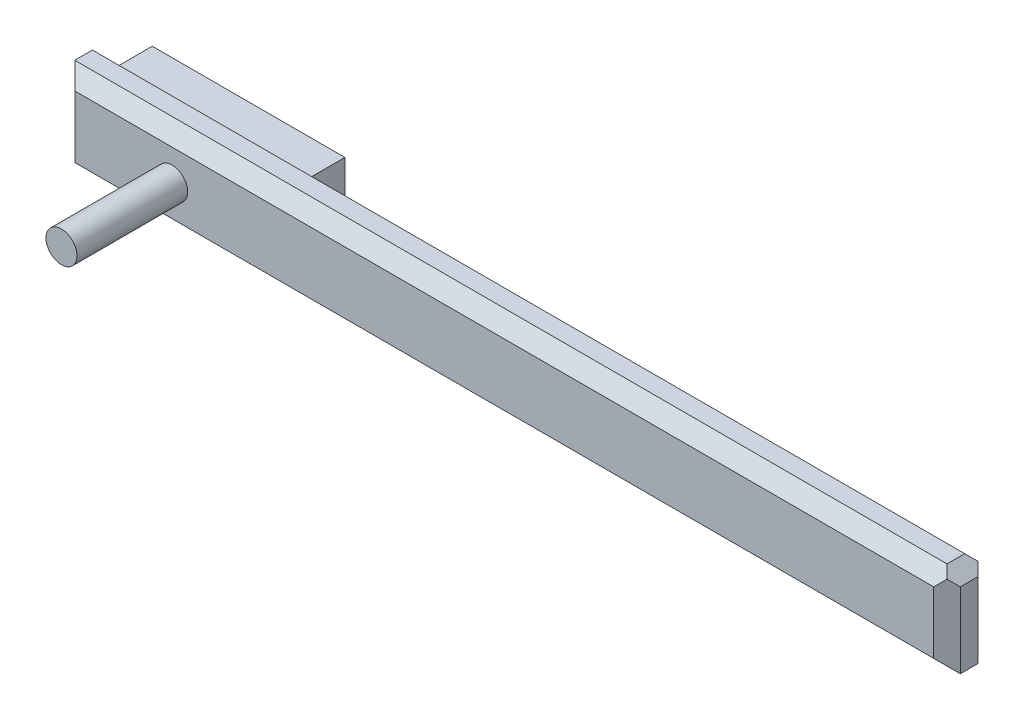
ISO-10303-21;
HEADER;
FILE_DESCRIPTION(('STEP AP214'),'2;1');
FILE_NAME('part.step','',(''),(''),'','','');
FILE_SCHEMA(('AUTOMOTIVE_DESIGN { 1 0 10303 214 1 1 1 1 }'));
ENDSEC;
DATA;
#1=APPLICATION_CONTEXT('core data for automotive mechanical design processes');
#2=APPLICATION_PROTOCOL_DEFINITION('international standard','automotive_design',2000,#1);
#3=PRODUCT_CONTEXT('',#1,'mechanical');
#4=PRODUCT('Part','Part','',(#3));
#5=PRODUCT_RELATED_PRODUCT_CATEGORY('part','',(#4));
#6=PRODUCT_DEFINITION_FORMATION('','',#4);
#7=PRODUCT_DEFINITION_CONTEXT('part definition',#1,'design');
#8=PRODUCT_DEFINITION('design','',#6,#7);
#9=PRODUCT_DEFINITION_SHAPE('','',#8);
#10=(LENGTH_UNIT() NAMED_UNIT(*) SI_UNIT(.MILLI.,.METRE.));
#11=(NAMED_UNIT(*) PLANE_ANGLE_UNIT() SI_UNIT($,.RADIAN.));
#12=(NAMED_UNIT(*) SI_UNIT($,.STERADIAN.) SOLID_ANGLE_UNIT());
#13=UNCERTAINTY_MEASURE_WITH_UNIT(LENGTH_MEASURE(1.E-05),#10,'distance_accuracy_value','');
#14=(GEOMETRIC_REPRESENTATION_CONTEXT(3) GLOBAL_UNCERTAINTY_ASSIGNED_CONTEXT((#13)) GLOBAL_UNIT_ASSIGNED_CONTEXT((#10,
#11,#12)) REPRESENTATION_CONTEXT('',''));
#15=CARTESIAN_POINT('',(0.,0.,0.));
#16=DIRECTION('',(0.,0.,1.));
#17=DIRECTION('',(1.,0.,0.));
#18=AXIS2_PLACEMENT_3D('',#15,#16,#17);
#19=CARTESIAN_POINT('',(0.,0.,0.));
#20=DIRECTION('',(0.,0.,1.));
#21=DIRECTION('',(1.,0.,0.));
#22=AXIS2_PLACEMENT_3D('',#19,#20,#21);
#23=PLANE('',#22);
#24=DIRECTION('',(0.,-1.,0.));
#25=VECTOR('',#24,1.);
#26=CARTESIAN_POINT('',(-5.34890927355179,0.7,0.));
#27=LINE('',#26,#25);
#28=CARTESIAN_POINT('',(-5.34890927355179,0.7,0.));
#29=VERTEX_POINT('',#28);
#30=CARTESIAN_POINT('',(-5.34890927355179,-0.7,0.));
#31=VERTEX_POINT('',#30);
#32=EDGE_CURVE('E58',#29,#31,#27,.T.);
#33=ORIENTED_EDGE('',*,*,#32,.F.);
#34=DIRECTION('',(1.,0.,0.));
#35=VECTOR('',#34,1.);
#36=CARTESIAN_POINT('',(0.,0.7,0.));
#37=LINE('',#36,#35);
#38=CARTESIAN_POINT('',(9.7,0.7,0.));
#39=VERTEX_POINT('',#38);
#40=EDGE_CURVE('E202',#29,#39,#37,.T.);
#41=ORIENTED_EDGE('',*,*,#40,.T.);
#42=DIRECTION('',(0.,-1.,0.));
#43=VECTOR('',#42,1.);
#44=CARTESIAN_POINT('',(9.7,0.,0.));
#45=LINE('',#44,#43);
#46=CARTESIAN_POINT('',(9.7,-0.7,0.));
#47=VERTEX_POINT('',#46);
#48=EDGE_CURVE('E205',#39,#47,#45,.T.);
#49=ORIENTED_EDGE('',*,*,#48,.T.);
#50=DIRECTION('',(-1.,0.,0.));
#51=VECTOR('',#50,1.);
#52=CARTESIAN_POINT('',(0.,-0.7,0.));
#53=LINE('',#52,#51);
#54=EDGE_CURVE('E242',#47,#31,#53,.T.);
#55=ORIENTED_EDGE('',*,*,#54,.T.);
#56=EDGE_LOOP('',(#33,#41,#49,#55));
#57=FACE_BOUND('',#56,.T.);
#58=ADVANCED_FACE('F41',(#57),#23,.F.);
#59=CARTESIAN_POINT('',(10.,1.,1.));
#60=DIRECTION('',(-1.,0.,0.));
#61=DIRECTION('',(0.,0.,1.));
#62=AXIS2_PLACEMENT_3D('',#59,#60,#61);
#63=PLANE('',#62);
#64=DIRECTION('',(0.,0.,-1.));
#65=VECTOR('',#64,1.);
#66=CARTESIAN_POINT('',(10.,-1.,1.));
#67=LINE('',#66,#65);
#68=CARTESIAN_POINT('',(10.,-1.,0.699999999999997));
#69=VERTEX_POINT('',#68);
#70=CARTESIAN_POINT('',(10.,-1.,0.3));
#71=VERTEX_POINT('',#70);
#72=EDGE_CURVE('E170',#69,#71,#67,.T.);
#73=ORIENTED_EDGE('',*,*,#72,.T.);
#74=DIRECTION('',(0.,1.,0.));
#75=VECTOR('',#74,1.);
#76=CARTESIAN_POINT('',(10.,1.,0.3));
#77=LINE('',#76,#75);
#78=CARTESIAN_POINT('',(10.,0.700000000000002,0.3));
#79=VERTEX_POINT('',#78);
#80=EDGE_CURVE('E191',#71,#79,#77,.T.);
#81=ORIENTED_EDGE('',*,*,#80,.T.);
#82=DIRECTION('',(0.,0.,1.));
#83=VECTOR('',#82,1.);
#84=CARTESIAN_POINT('',(10.,0.700000000000002,1.));
#85=LINE('',#84,#83);
#86=CARTESIAN_POINT('',(10.,0.700000000000002,0.699999999999997));
#87=VERTEX_POINT('',#86);
#88=EDGE_CURVE('E186',#79,#87,#85,.T.);
#89=ORIENTED_EDGE('',*,*,#88,.T.);
#90=DIRECTION('',(0.,-1.,0.));
#91=VECTOR('',#90,1.);
#92=CARTESIAN_POINT('',(10.,-1.,0.699999999999997));
#93=LINE('',#92,#91);
#94=EDGE_CURVE('E189',#87,#69,#93,.T.);
#95=ORIENTED_EDGE('',*,*,#94,.T.);
#96=EDGE_LOOP('',(#73,#81,#89,#95));
#97=FACE_BOUND('',#96,.T.);
#98=ADVANCED_FACE('F257',(#97),#63,.F.);
#99=CARTESIAN_POINT('',(-10.,1.,1.));
#100=DIRECTION('',(0.,-1.,0.));
#101=DIRECTION('',(0.,0.,-1.));
#102=AXIS2_PLACEMENT_3D('',#99,#100,#101);
#103=PLANE('',#102);
#104=DIRECTION('',(0.,0.,-1.));
#105=VECTOR('',#104,1.);
#106=CARTESIAN_POINT('',(9.7,1.,1.));
#107=LINE('',#106,#105);
#108=CARTESIAN_POINT('',(9.7,1.,0.699999999999997));
#109=VERTEX_POINT('',#108);
#110=CARTESIAN_POINT('',(9.7,1.,0.3));
#111=VERTEX_POINT('',#110);
#112=EDGE_CURVE('E183',#109,#111,#107,.T.);
#113=ORIENTED_EDGE('',*,*,#112,.T.);
#114=DIRECTION('',(-1.,0.,0.));
#115=VECTOR('',#114,1.);
#116=CARTESIAN_POINT('',(-10.,1.,0.3));
#117=LINE('',#116,#115);
#118=CARTESIAN_POINT('',(-10.,1.,0.3));
#119=VERTEX_POINT('',#118);
#120=EDGE_CURVE('E221',#111,#119,#117,.T.);
#121=ORIENTED_EDGE('',*,*,#120,.T.);
#122=DIRECTION('',(0.,0.,-1.));
#123=VECTOR('',#122,1.);
#124=CARTESIAN_POINT('',(-10.,1.,1.));
#125=LINE('',#124,#123);
#126=CARTESIAN_POINT('',(-10.,1.,0.699999999999997));
#127=VERTEX_POINT('',#126);
#128=EDGE_CURVE('E180',#127,#119,#125,.T.);
#129=ORIENTED_EDGE('',*,*,#128,.F.);
#130=DIRECTION('',(1.,0.,0.));
#131=VECTOR('',#130,1.);
#132=CARTESIAN_POINT('',(9.7,1.,0.699999999999997));
#133=LINE('',#132,#131);
#134=EDGE_CURVE('E219',#127,#109,#133,.T.);
#135=ORIENTED_EDGE('',*,*,#134,.T.);
#136=EDGE_LOOP('',(#113,#121,#129,#135));
#137=FACE_BOUND('',#136,.T.);
#138=ADVANCED_FACE('F276',(#137),#103,.F.);
#139=CARTESIAN_POINT('',(-10.,1.,1.));
#140=DIRECTION('',(1.,0.,0.));
#141=DIRECTION('',(0.,0.,-1.));
#142=AXIS2_PLACEMENT_3D('',#139,#140,#141);
#143=PLANE('',#142);
#144=DIRECTION('',(0.,0.,-1.));
#145=VECTOR('',#144,1.);
#146=CARTESIAN_POINT('',(-10.,-1.,1.));
#147=LINE('',#146,#145);
#148=CARTESIAN_POINT('',(-10.,-1.,0.699999999999997));
#149=VERTEX_POINT('',#148);
#150=CARTESIAN_POINT('',(-10.,-1.,0.3));
#151=VERTEX_POINT('',#150);
#152=EDGE_CURVE('E177',#149,#151,#147,.T.);
#153=ORIENTED_EDGE('',*,*,#152,.F.);
#154=DIRECTION('',(0.,1.,0.));
#155=VECTOR('',#154,1.);
#156=CARTESIAN_POINT('',(-10.,0.699999999999998,0.700000000000002));
#157=LINE('',#156,#155);
#158=EDGE_CURVE('E238',#149,#127,#157,.T.);
#159=ORIENTED_EDGE('',*,*,#158,.T.);
#160=ORIENTED_EDGE('',*,*,#128,.T.);
#161=DIRECTION('',(0.,-1.,0.));
#162=VECTOR('',#161,1.);
#163=CARTESIAN_POINT('',(-10.,1.,0.3));
#164=LINE('',#163,#162);
#165=EDGE_CURVE('E235',#119,#151,#164,.T.);
#166=ORIENTED_EDGE('',*,*,#165,.T.);
#167=EDGE_LOOP('',(#153,#159,#160,#166));
#168=FACE_BOUND('',#167,.T.);
#169=ADVANCED_FACE('F321',(#168),#143,.F.);
#170=CARTESIAN_POINT('',(-10.,-1.,1.));
#171=DIRECTION('',(0.,1.,0.));
#172=DIRECTION('',(0.,0.,1.));
#173=AXIS2_PLACEMENT_3D('',#170,#171,#172);
#174=PLANE('',#173);
#175=ORIENTED_EDGE('',*,*,#152,.T.);
#176=DIRECTION('',(1.,0.,0.));
#177=VECTOR('',#176,1.);
#178=CARTESIAN_POINT('',(-10.,-1.,0.3));
#179=LINE('',#178,#177);
#180=EDGE_CURVE('E51',#151,#71,#179,.T.);
#181=ORIENTED_EDGE('',*,*,#180,.T.);
#182=ORIENTED_EDGE('',*,*,#72,.F.);
#183=DIRECTION('',(-1.,0.,0.));
#184=VECTOR('',#183,1.);
#185=CARTESIAN_POINT('',(-10.,-1.,0.699999999999997));
#186=LINE('',#185,#184);
#187=EDGE_CURVE('E208',#69,#149,#186,.T.);
#188=ORIENTED_EDGE('',*,*,#187,.T.);
#189=EDGE_LOOP('',(#175,#181,#182,#188));
#190=FACE_BOUND('',#189,.T.);
#191=ADVANCED_FACE('F250',(#190),#174,.F.);
#192=CARTESIAN_POINT('',(0.,0.,1.));
#193=DIRECTION('',(0.,0.,1.));
#194=DIRECTION('',(1.,0.,0.));
#195=AXIS2_PLACEMENT_3D('',#192,#193,#194);
#196=PLANE('',#195);
#197=CARTESIAN_POINT('',(-7.5,0.,1.));
#198=DIRECTION('',(0.,0.,1.));
#199=DIRECTION('',(1.,0.,0.));
#200=AXIS2_PLACEMENT_3D('',#197,#198,#199);
#201=CIRCLE('',#200,0.35);
#202=CARTESIAN_POINT('',(-7.15,0.,1.));
#203=VERTEX_POINT('',#202);
#204=EDGE_CURVE('E171',#203,#203,#201,.T.);
#205=ORIENTED_EDGE('',*,*,#204,.F.);
#206=EDGE_LOOP('',(#205));
#207=FACE_BOUND('',#206,.T.);
#208=DIRECTION('',(-1.,0.,0.));
#209=VECTOR('',#208,1.);
#210=CARTESIAN_POINT('',(-10.,0.699999999999998,1.));
#211=LINE('',#210,#209);
#212=CARTESIAN_POINT('',(9.7,0.699999999999998,1.));
#213=VERTEX_POINT('',#212);
#214=CARTESIAN_POINT('',(-9.7,0.699999999999998,1.));
#215=VERTEX_POINT('',#214);
#216=EDGE_CURVE('E211',#213,#215,#211,.T.);
#217=ORIENTED_EDGE('',*,*,#216,.T.);
#218=DIRECTION('',(0.,-1.,0.));
#219=VECTOR('',#218,1.);
#220=CARTESIAN_POINT('',(-9.7,-0.699999999999998,1.));
#221=LINE('',#220,#219);
#222=CARTESIAN_POINT('',(-9.7,-0.699999999999998,1.));
#223=VERTEX_POINT('',#222);
#224=EDGE_CURVE('E224',#215,#223,#221,.T.);
#225=ORIENTED_EDGE('',*,*,#224,.T.);
#226=DIRECTION('',(1.,0.,0.));
#227=VECTOR('',#226,1.);
#228=CARTESIAN_POINT('',(10.,-0.699999999999998,1.));
#229=LINE('',#228,#227);
#230=CARTESIAN_POINT('',(9.7,-0.699999999999998,1.));
#231=VERTEX_POINT('',#230);
#232=EDGE_CURVE('E217',#223,#231,#229,.T.);
#233=ORIENTED_EDGE('',*,*,#232,.T.);
#234=DIRECTION('',(0.,1.,0.));
#235=VECTOR('',#234,1.);
#236=CARTESIAN_POINT('',(9.7,0.700000000000002,1.));
#237=LINE('',#236,#235);
#238=EDGE_CURVE('E214',#231,#213,#237,.T.);
#239=ORIENTED_EDGE('',*,*,#238,.T.);
#240=EDGE_LOOP('',(#217,#225,#233,#239));
#241=FACE_BOUND('',#240,.T.);
#242=ADVANCED_FACE('F290',(#207,#241),#196,.T.);
#243=CARTESIAN_POINT('',(-7.5,0.,3.5));
#244=DIRECTION('',(0.,0.,-1.));
#245=DIRECTION('',(-1.,0.,0.));
#246=AXIS2_PLACEMENT_3D('',#243,#244,#245);
#247=CYLINDRICAL_SURFACE('',#246,0.35);
#248=CARTESIAN_POINT('',(-7.5,0.,3.5));
#249=DIRECTION('',(0.,0.,1.));
#250=DIRECTION('',(1.,0.,0.));
#251=AXIS2_PLACEMENT_3D('',#248,#249,#250);
#252=CIRCLE('',#251,0.35);
#253=CARTESIAN_POINT('',(-7.15,0.,3.5));
#254=VERTEX_POINT('',#253);
#255=EDGE_CURVE('E167',#254,#254,#252,.T.);
#256=ORIENTED_EDGE('',*,*,#255,.F.);
#257=EDGE_LOOP('',(#256));
#258=FACE_BOUND('',#257,.T.);
#259=ORIENTED_EDGE('',*,*,#204,.T.);
#260=EDGE_LOOP('',(#259));
#261=FACE_BOUND('',#260,.T.);
#262=ADVANCED_FACE('F445',(#258,#261),#247,.T.);
#263=CARTESIAN_POINT('',(-7.5,0.,3.5));
#264=DIRECTION('',(0.,0.,1.));
#265=DIRECTION('',(1.,0.,0.));
#266=AXIS2_PLACEMENT_3D('',#263,#264,#265);
#267=PLANE('',#266);
#268=ORIENTED_EDGE('',*,*,#255,.T.);
#269=EDGE_LOOP('',(#268));
#270=FACE_BOUND('',#269,.T.);
#271=ADVANCED_FACE('F332',(#270),#267,.T.);
#272=CARTESIAN_POINT('',(9.7,1.,1.));
#273=DIRECTION('',(-0.707106781186547,-0.707106781186547,0.));
#274=DIRECTION('',(0.,0.,-1.));
#275=AXIS2_PLACEMENT_3D('',#272,#273,#274);
#276=PLANE('',#275);
#277=ORIENTED_EDGE('',*,*,#88,.F.);
#278=DIRECTION('',(-0.577350269189626,0.577350269189626,-0.577350269189626));
#279=VECTOR('',#278,1.);
#280=CARTESIAN_POINT('',(10.0333333333333,0.666666666666667,0.333333333333334));
#281=LINE('',#280,#279);
#282=CARTESIAN_POINT('',(9.85,0.850000000000001,0.150000000000001));
#283=VERTEX_POINT('',#282);
#284=EDGE_CURVE('E200',#79,#283,#281,.T.);
#285=ORIENTED_EDGE('',*,*,#284,.T.);
#286=DIRECTION('',(-0.577350269189626,0.577350269189626,0.577350269189626));
#287=VECTOR('',#286,1.);
#288=CARTESIAN_POINT('',(9.46666666666667,1.23333333333333,0.533333333333333));
#289=LINE('',#288,#287);
#290=EDGE_CURVE('E198',#283,#111,#289,.T.);
#291=ORIENTED_EDGE('',*,*,#290,.T.);
#292=ORIENTED_EDGE('',*,*,#112,.F.);
#293=DIRECTION('',(-0.577350269189625,0.577350269189625,-0.577350269189628));
#294=VECTOR('',#293,1.);
#295=CARTESIAN_POINT('',(9.8,0.899999999999999,0.799999999999998));
#296=LINE('',#295,#294);
#297=CARTESIAN_POINT('',(9.85,0.850000000000001,0.849999999999996));
#298=VERTEX_POINT('',#297);
#299=EDGE_CURVE('E194',#109,#298,#296,.F.);
#300=ORIENTED_EDGE('',*,*,#299,.T.);
#301=DIRECTION('',(-0.577350269189625,0.577350269189625,0.577350269189628));
#302=VECTOR('',#301,1.);
#303=CARTESIAN_POINT('',(9.7,1.,0.999999999999998));
#304=LINE('',#303,#302);
#305=EDGE_CURVE('E196',#298,#87,#304,.F.);
#306=ORIENTED_EDGE('',*,*,#305,.T.);
#307=EDGE_LOOP('',(#277,#285,#291,#292,#300,#306));
#308=FACE_BOUND('',#307,.T.);
#309=ADVANCED_FACE('F273',(#308),#276,.F.);
#310=CARTESIAN_POINT('',(-10.,1.,0.3));
#311=DIRECTION('',(0.,-0.707106781186547,0.707106781186547));
#312=DIRECTION('',(-1.,0.,0.));
#313=AXIS2_PLACEMENT_3D('',#310,#311,#312);
#314=PLANE('',#313);
#315=CARTESIAN_POINT('',(-9.7,0.7,0.));
#316=VERTEX_POINT('',#315);
#317=EDGE_CURVE('E203',#316,#29,#37,.T.);
#318=ORIENTED_EDGE('',*,*,#317,.F.);
#319=DIRECTION('',(-0.577350269189626,0.577350269189626,0.577350269189626));
#320=VECTOR('',#319,1.);
#321=CARTESIAN_POINT('',(-10.,1.,0.3));
#322=LINE('',#321,#320);
#323=EDGE_CURVE('E245',#316,#119,#322,.T.);
#324=ORIENTED_EDGE('',*,*,#323,.T.);
#325=ORIENTED_EDGE('',*,*,#120,.F.);
#326=ORIENTED_EDGE('',*,*,#290,.F.);
#327=DIRECTION('',(0.577350269189626,0.577350269189626,0.577350269189626));
#328=VECTOR('',#327,1.);
#329=CARTESIAN_POINT('',(10.,1.,0.3));
#330=LINE('',#329,#328);
#331=EDGE_CURVE('E174',#39,#283,#330,.T.);
#332=ORIENTED_EDGE('',*,*,#331,.F.);
#333=ORIENTED_EDGE('',*,*,#40,.F.);
#334=EDGE_LOOP('',(#318,#324,#325,#326,#332,#333));
#335=FACE_BOUND('',#334,.T.);
#336=ADVANCED_FACE('F269',(#335),#314,.F.);
#337=CARTESIAN_POINT('',(10.,1.,0.3));
#338=DIRECTION('',(-0.707106781186547,0.,0.707106781186547));
#339=DIRECTION('',(0.,1.,0.));
#340=AXIS2_PLACEMENT_3D('',#337,#338,#339);
#341=PLANE('',#340);
#342=ORIENTED_EDGE('',*,*,#80,.F.);
#343=DIRECTION('',(-0.577350269189626,0.577350269189626,-0.577350269189626));
#344=VECTOR('',#343,1.);
#345=CARTESIAN_POINT('',(9.33333333333333,-0.333333333333333,-0.366666666666667));
#346=LINE('',#345,#344);
#347=EDGE_CURVE('E11',#71,#47,#346,.T.);
#348=ORIENTED_EDGE('',*,*,#347,.T.);
#349=ORIENTED_EDGE('',*,*,#48,.F.);
#350=ORIENTED_EDGE('',*,*,#331,.T.);
#351=ORIENTED_EDGE('',*,*,#284,.F.);
#352=EDGE_LOOP('',(#342,#348,#349,#350,#351));
#353=FACE_BOUND('',#352,.T.);
#354=ADVANCED_FACE('F261',(#353),#341,.F.);
#355=CARTESIAN_POINT('',(0.,-0.699999999999998,1.));
#356=DIRECTION('',(0.,-0.70710678118655,0.707106781186545));
#357=DIRECTION('',(-1.,0.,0.));
#358=AXIS2_PLACEMENT_3D('',#355,#356,#357);
#359=PLANE('',#358);
#360=ORIENTED_EDGE('',*,*,#232,.F.);
#361=DIRECTION('',(-0.577350269189625,-0.577350269189625,-0.577350269189628));
#362=VECTOR('',#361,1.);
#363=CARTESIAN_POINT('',(-6.46666666666668,2.53333333333332,4.23333333333334));
#364=LINE('',#363,#362);
#365=EDGE_CURVE('E233',#223,#149,#364,.T.);
#366=ORIENTED_EDGE('',*,*,#365,.T.);
#367=ORIENTED_EDGE('',*,*,#187,.F.);
#368=DIRECTION('',(-0.577350269189625,0.577350269189625,0.577350269189628));
#369=VECTOR('',#368,1.);
#370=CARTESIAN_POINT('',(6.46666666666668,2.53333333333332,4.23333333333334));
#371=LINE('',#370,#369);
#372=EDGE_CURVE('E227',#231,#69,#371,.F.);
#373=ORIENTED_EDGE('',*,*,#372,.F.);
#374=EDGE_LOOP('',(#360,#366,#367,#373));
#375=FACE_BOUND('',#374,.T.);
#376=ADVANCED_FACE('F293',(#375),#359,.T.);
#377=CARTESIAN_POINT('',(0.,0.699999999999998,1.));
#378=DIRECTION('',(0.,0.70710678118655,0.707106781186545));
#379=DIRECTION('',(1.,0.,0.));
#380=AXIS2_PLACEMENT_3D('',#377,#378,#379);
#381=PLANE('',#380);
#382=ORIENTED_EDGE('',*,*,#134,.F.);
#383=DIRECTION('',(0.577350269189625,-0.577350269189625,0.577350269189628));
#384=VECTOR('',#383,1.);
#385=CARTESIAN_POINT('',(-6.46666666666668,-2.53333333333332,4.23333333333334));
#386=LINE('',#385,#384);
#387=EDGE_CURVE('E240',#127,#215,#386,.T.);
#388=ORIENTED_EDGE('',*,*,#387,.T.);
#389=ORIENTED_EDGE('',*,*,#216,.F.);
#390=DIRECTION('',(0.577350269189625,0.577350269189625,-0.577350269189628));
#391=VECTOR('',#390,1.);
#392=CARTESIAN_POINT('',(6.46666666666668,-2.53333333333332,4.23333333333334));
#393=LINE('',#392,#391);
#394=EDGE_CURVE('E162',#298,#213,#393,.F.);
#395=ORIENTED_EDGE('',*,*,#394,.F.);
#396=ORIENTED_EDGE('',*,*,#299,.F.);
#397=EDGE_LOOP('',(#382,#388,#389,#395,#396));
#398=FACE_BOUND('',#397,.T.);
#399=ADVANCED_FACE('F281',(#398),#381,.T.);
#400=CARTESIAN_POINT('',(9.7,0.,1.));
#401=DIRECTION('',(0.70710678118655,0.,0.707106781186545));
#402=DIRECTION('',(0.,-1.,0.));
#403=AXIS2_PLACEMENT_3D('',#400,#401,#402);
#404=PLANE('',#403);
#405=ORIENTED_EDGE('',*,*,#372,.T.);
#406=ORIENTED_EDGE('',*,*,#94,.F.);
#407=ORIENTED_EDGE('',*,*,#305,.F.);
#408=ORIENTED_EDGE('',*,*,#394,.T.);
#409=ORIENTED_EDGE('',*,*,#238,.F.);
#410=EDGE_LOOP('',(#405,#406,#407,#408,#409));
#411=FACE_BOUND('',#410,.T.);
#412=ADVANCED_FACE('F296',(#411),#404,.T.);
#413=CARTESIAN_POINT('',(-9.7,0.,1.));
#414=DIRECTION('',(-0.70710678118655,0.,0.707106781186545));
#415=DIRECTION('',(0.,1.,0.));
#416=AXIS2_PLACEMENT_3D('',#413,#414,#415);
#417=PLANE('',#416);
#418=ORIENTED_EDGE('',*,*,#387,.F.);
#419=ORIENTED_EDGE('',*,*,#158,.F.);
#420=ORIENTED_EDGE('',*,*,#365,.F.);
#421=ORIENTED_EDGE('',*,*,#224,.F.);
#422=EDGE_LOOP('',(#418,#419,#420,#421));
#423=FACE_BOUND('',#422,.T.);
#424=ADVANCED_FACE('F287',(#423),#417,.T.);
#425=CARTESIAN_POINT('',(-10.,-1.,0.3));
#426=DIRECTION('',(0.,0.707106781186547,0.707106781186547));
#427=DIRECTION('',(1.,0.,0.));
#428=AXIS2_PLACEMENT_3D('',#425,#426,#427);
#429=PLANE('',#428);
#430=ORIENTED_EDGE('',*,*,#347,.F.);
#431=ORIENTED_EDGE('',*,*,#180,.F.);
#432=DIRECTION('',(0.577350269189626,0.577350269189626,-0.577350269189626));
#433=VECTOR('',#432,1.);
#434=CARTESIAN_POINT('',(-10.,-1.,0.3));
#435=LINE('',#434,#433);
#436=CARTESIAN_POINT('',(-9.7,-0.7,0.));
#437=VERTEX_POINT('',#436);
#438=EDGE_CURVE('E46',#437,#151,#435,.F.);
#439=ORIENTED_EDGE('',*,*,#438,.F.);
#440=DIRECTION('',(-1.,0.,0.));
#441=VECTOR('',#440,1.);
#442=CARTESIAN_POINT('',(-9.7,-0.7,0.));
#443=LINE('',#442,#441);
#444=EDGE_CURVE('E158',#31,#437,#443,.T.);
#445=ORIENTED_EDGE('',*,*,#444,.F.);
#446=ORIENTED_EDGE('',*,*,#54,.F.);
#447=EDGE_LOOP('',(#430,#431,#439,#445,#446));
#448=FACE_BOUND('',#447,.T.);
#449=ADVANCED_FACE('F44',(#448),#429,.F.);
#450=CARTESIAN_POINT('',(-10.,1.,0.3));
#451=DIRECTION('',(0.707106781186547,0.,0.707106781186547));
#452=DIRECTION('',(0.,-1.,0.));
#453=AXIS2_PLACEMENT_3D('',#450,#451,#452);
#454=PLANE('',#453);
#455=ORIENTED_EDGE('',*,*,#323,.F.);
#456=DIRECTION('',(0.,1.,0.));
#457=VECTOR('',#456,1.);
#458=CARTESIAN_POINT('',(-9.7,0.,0.));
#459=LINE('',#458,#457);
#460=EDGE_CURVE('E66',#437,#316,#459,.T.);
#461=ORIENTED_EDGE('',*,*,#460,.F.);
#462=ORIENTED_EDGE('',*,*,#438,.T.);
#463=ORIENTED_EDGE('',*,*,#165,.F.);
#464=EDGE_LOOP('',(#455,#461,#462,#463));
#465=FACE_BOUND('',#464,.T.);
#466=ADVANCED_FACE('F351',(#465),#454,.F.);
#467=CARTESIAN_POINT('',(-9.7,0.7,-0.75));
#468=DIRECTION('',(1.,0.,0.));
#469=DIRECTION('',(0.,0.,-1.));
#470=AXIS2_PLACEMENT_3D('',#467,#468,#469);
#471=PLANE('',#470);
#472=ORIENTED_EDGE('',*,*,#460,.T.);
#473=DIRECTION('',(0.,0.,1.));
#474=VECTOR('',#473,1.);
#475=CARTESIAN_POINT('',(-9.7,0.7,-0.75));
#476=LINE('',#475,#474);
#477=CARTESIAN_POINT('',(-9.7,0.7,-0.75));
#478=VERTEX_POINT('',#477);
#479=EDGE_CURVE('E143',#478,#316,#476,.T.);
#480=ORIENTED_EDGE('',*,*,#479,.F.);
#481=DIRECTION('',(0.,1.,0.));
#482=VECTOR('',#481,1.);
#483=CARTESIAN_POINT('',(-9.7,0.7,-0.75));
#484=LINE('',#483,#482);
#485=CARTESIAN_POINT('',(-9.7,-0.7,-0.75));
#486=VERTEX_POINT('',#485);
#487=EDGE_CURVE('E149',#486,#478,#484,.T.);
#488=ORIENTED_EDGE('',*,*,#487,.F.);
#489=DIRECTION('',(0.,0.,1.));
#490=VECTOR('',#489,1.);
#491=CARTESIAN_POINT('',(-9.7,-0.7,-0.75));
#492=LINE('',#491,#490);
#493=EDGE_CURVE('E514',#486,#437,#492,.T.);
#494=ORIENTED_EDGE('',*,*,#493,.T.);
#495=EDGE_LOOP('',(#472,#480,#488,#494));
#496=FACE_BOUND('',#495,.T.);
#497=ADVANCED_FACE('F160',(#496),#471,.F.);
#498=CARTESIAN_POINT('',(-9.7,0.7,-0.75));
#499=DIRECTION('',(0.,-1.,0.));
#500=DIRECTION('',(0.,0.,-1.));
#501=AXIS2_PLACEMENT_3D('',#498,#499,#500);
#502=PLANE('',#501);
#503=ORIENTED_EDGE('',*,*,#317,.T.);
#504=DIRECTION('',(0.,0.,1.));
#505=VECTOR('',#504,1.);
#506=CARTESIAN_POINT('',(-5.34890927355179,0.7,-0.75));
#507=LINE('',#506,#505);
#508=CARTESIAN_POINT('',(-5.34890927355179,0.7,-0.75));
#509=VERTEX_POINT('',#508);
#510=EDGE_CURVE('E145',#509,#29,#507,.T.);
#511=ORIENTED_EDGE('',*,*,#510,.F.);
#512=DIRECTION('',(1.,0.,0.));
#513=VECTOR('',#512,1.);
#514=CARTESIAN_POINT('',(-9.7,0.7,-0.75));
#515=LINE('',#514,#513);
#516=EDGE_CURVE('E138',#478,#509,#515,.T.);
#517=ORIENTED_EDGE('',*,*,#516,.F.);
#518=ORIENTED_EDGE('',*,*,#479,.T.);
#519=EDGE_LOOP('',(#503,#511,#517,#518));
#520=FACE_BOUND('',#519,.T.);
#521=ADVANCED_FACE('F141',(#520),#502,.F.);
#522=CARTESIAN_POINT('',(-5.34890927355179,0.7,-0.75));
#523=DIRECTION('',(-1.,0.,0.));
#524=DIRECTION('',(0.,0.,1.));
#525=AXIS2_PLACEMENT_3D('',#522,#523,#524);
#526=PLANE('',#525);
#527=ORIENTED_EDGE('',*,*,#32,.T.);
#528=DIRECTION('',(0.,0.,1.));
#529=VECTOR('',#528,1.);
#530=CARTESIAN_POINT('',(-5.34890927355179,-0.7,-0.75));
#531=LINE('',#530,#529);
#532=CARTESIAN_POINT('',(-5.34890927355179,-0.7,-0.75));
#533=VERTEX_POINT('',#532);
#534=EDGE_CURVE('E163',#533,#31,#531,.T.);
#535=ORIENTED_EDGE('',*,*,#534,.F.);
#536=DIRECTION('',(0.,-1.,0.));
#537=VECTOR('',#536,1.);
#538=CARTESIAN_POINT('',(-5.34890927355179,0.7,-0.75));
#539=LINE('',#538,#537);
#540=EDGE_CURVE('E148',#509,#533,#539,.T.);
#541=ORIENTED_EDGE('',*,*,#540,.F.);
#542=ORIENTED_EDGE('',*,*,#510,.T.);
#543=EDGE_LOOP('',(#527,#535,#541,#542));
#544=FACE_BOUND('',#543,.T.);
#545=ADVANCED_FACE('F373',(#544),#526,.F.);
#546=CARTESIAN_POINT('',(-9.7,-0.7,-0.75));
#547=DIRECTION('',(0.,1.,0.));
#548=DIRECTION('',(0.,0.,1.));
#549=AXIS2_PLACEMENT_3D('',#546,#547,#548);
#550=PLANE('',#549);
#551=ORIENTED_EDGE('',*,*,#444,.T.);
#552=ORIENTED_EDGE('',*,*,#493,.F.);
#553=DIRECTION('',(-1.,0.,0.));
#554=VECTOR('',#553,1.);
#555=CARTESIAN_POINT('',(-9.7,-0.7,-0.75));
#556=LINE('',#555,#554);
#557=EDGE_CURVE('E154',#533,#486,#556,.T.);
#558=ORIENTED_EDGE('',*,*,#557,.F.);
#559=ORIENTED_EDGE('',*,*,#534,.T.);
#560=EDGE_LOOP('',(#551,#552,#558,#559));
#561=FACE_BOUND('',#560,.T.);
#562=ADVANCED_FACE('F381',(#561),#550,.F.);
#563=CARTESIAN_POINT('',(0.,0.,-0.75));
#564=DIRECTION('',(0.,0.,1.));
#565=DIRECTION('',(1.,0.,0.));
#566=AXIS2_PLACEMENT_3D('',#563,#564,#565);
#567=PLANE('',#566);
#568=ORIENTED_EDGE('',*,*,#487,.T.);
#569=ORIENTED_EDGE('',*,*,#516,.T.);
#570=ORIENTED_EDGE('',*,*,#540,.T.);
#571=ORIENTED_EDGE('',*,*,#557,.T.);
#572=EDGE_LOOP('',(#568,#569,#570,#571));
#573=FACE_BOUND('',#572,.T.);
#574=ADVANCED_FACE('F152',(#573),#567,.F.);
#575=CLOSED_SHELL('',(#58,#98,#138,#169,#191,#242,#262,#271,#309,#336,#354,#376,#399,#412,#424,
#449,#466,#497,#521,#545,#562,#574));
#576=MANIFOLD_SOLID_BREP('B2',#575);
#577=ADVANCED_BREP_SHAPE_REPRESENTATION('',(#18,#576),#14);
#578=SHAPE_DEFINITION_REPRESENTATION(#9,#577);
ENDSEC;
END-ISO-10303-21;
